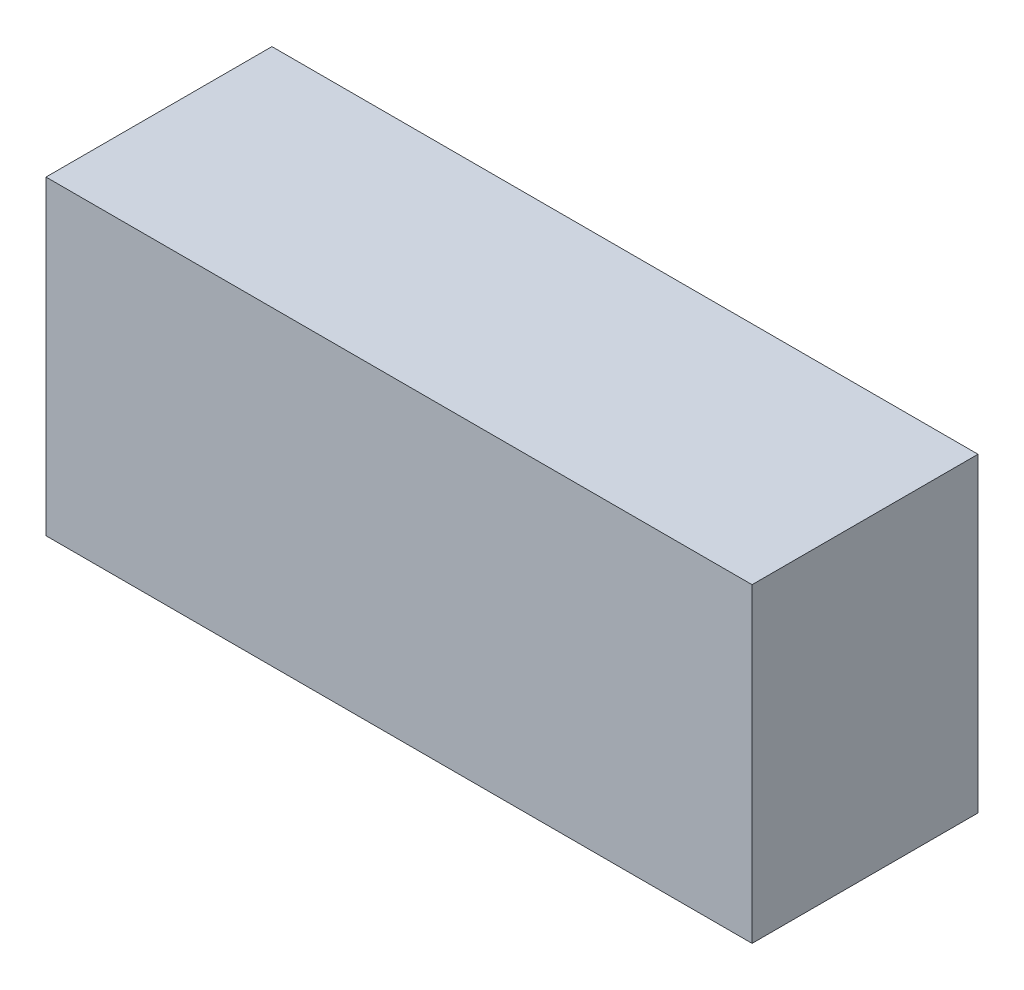
ISO-10303-21;
HEADER;
FILE_DESCRIPTION(('STEP AP214'),'2;1');
FILE_NAME('part.step','',(''),(''),'','','');
FILE_SCHEMA(('AUTOMOTIVE_DESIGN { 1 0 10303 214 1 1 1 1 }'));
ENDSEC;
DATA;
#1=APPLICATION_CONTEXT('core data for automotive mechanical design processes');
#2=APPLICATION_PROTOCOL_DEFINITION('international standard','automotive_design',2000,#1);
#3=PRODUCT_CONTEXT('',#1,'mechanical');
#4=PRODUCT('Part','Part','',(#3));
#5=PRODUCT_RELATED_PRODUCT_CATEGORY('part','',(#4));
#6=PRODUCT_DEFINITION_FORMATION('','',#4);
#7=PRODUCT_DEFINITION_CONTEXT('part definition',#1,'design');
#8=PRODUCT_DEFINITION('design','',#6,#7);
#9=PRODUCT_DEFINITION_SHAPE('','',#8);
#10=(LENGTH_UNIT() NAMED_UNIT(*) SI_UNIT(.MILLI.,.METRE.));
#11=(NAMED_UNIT(*) PLANE_ANGLE_UNIT() SI_UNIT($,.RADIAN.));
#12=(NAMED_UNIT(*) SI_UNIT($,.STERADIAN.) SOLID_ANGLE_UNIT());
#13=UNCERTAINTY_MEASURE_WITH_UNIT(LENGTH_MEASURE(1.E-05),#10,'distance_accuracy_value','');
#14=(GEOMETRIC_REPRESENTATION_CONTEXT(3) GLOBAL_UNCERTAINTY_ASSIGNED_CONTEXT((#13)) GLOBAL_UNIT_ASSIGNED_CONTEXT((#10,
#11,#12)) REPRESENTATION_CONTEXT('',''));
#15=CARTESIAN_POINT('',(0.,0.,0.));
#16=DIRECTION('',(0.,0.,1.));
#17=DIRECTION('',(1.,0.,0.));
#18=AXIS2_PLACEMENT_3D('',#15,#16,#17);
#19=CARTESIAN_POINT('',(-25.,-11.,16.));
#20=DIRECTION('',(1.,0.,0.));
#21=DIRECTION('',(0.,0.,-1.));
#22=AXIS2_PLACEMENT_3D('',#19,#20,#21);
#23=PLANE('',#22);
#24=DIRECTION('',(0.,-1.,0.));
#25=VECTOR('',#24,1.);
#26=CARTESIAN_POINT('',(-25.,-11.,0.));
#27=LINE('',#26,#25);
#28=CARTESIAN_POINT('',(-25.,11.,0.));
#29=VERTEX_POINT('',#28);
#30=CARTESIAN_POINT('',(-25.,-11.,0.));
#31=VERTEX_POINT('',#30);
#32=EDGE_CURVE('E102',#29,#31,#27,.T.);
#33=ORIENTED_EDGE('',*,*,#32,.T.);
#34=DIRECTION('',(0.,0.,-1.));
#35=VECTOR('',#34,1.);
#36=CARTESIAN_POINT('',(-25.,-11.,16.));
#37=LINE('',#36,#35);
#38=CARTESIAN_POINT('',(-25.,-11.,16.));
#39=VERTEX_POINT('',#38);
#40=EDGE_CURVE('E11',#39,#31,#37,.T.);
#41=ORIENTED_EDGE('',*,*,#40,.F.);
#42=DIRECTION('',(0.,-1.,0.));
#43=VECTOR('',#42,1.);
#44=CARTESIAN_POINT('',(-25.,-11.,16.));
#45=LINE('',#44,#43);
#46=CARTESIAN_POINT('',(-25.,11.,16.));
#47=VERTEX_POINT('',#46);
#48=EDGE_CURVE('E90',#47,#39,#45,.T.);
#49=ORIENTED_EDGE('',*,*,#48,.F.);
#50=DIRECTION('',(0.,0.,-1.));
#51=VECTOR('',#50,1.);
#52=CARTESIAN_POINT('',(-25.,11.,16.));
#53=LINE('',#52,#51);
#54=EDGE_CURVE('E98',#47,#29,#53,.T.);
#55=ORIENTED_EDGE('',*,*,#54,.T.);
#56=EDGE_LOOP('',(#33,#41,#49,#55));
#57=FACE_BOUND('',#56,.T.);
#58=ADVANCED_FACE('F39',(#57),#23,.F.);
#59=CARTESIAN_POINT('',(-25.,-11.,16.));
#60=DIRECTION('',(0.,1.,0.));
#61=DIRECTION('',(0.,0.,1.));
#62=AXIS2_PLACEMENT_3D('',#59,#60,#61);
#63=PLANE('',#62);
#64=DIRECTION('',(1.,0.,0.));
#65=VECTOR('',#64,1.);
#66=CARTESIAN_POINT('',(-25.,-11.,0.));
#67=LINE('',#66,#65);
#68=CARTESIAN_POINT('',(25.,-11.,0.));
#69=VERTEX_POINT('',#68);
#70=EDGE_CURVE('E94',#31,#69,#67,.T.);
#71=ORIENTED_EDGE('',*,*,#70,.T.);
#72=DIRECTION('',(0.,0.,-1.));
#73=VECTOR('',#72,1.);
#74=CARTESIAN_POINT('',(25.,-11.,16.));
#75=LINE('',#74,#73);
#76=CARTESIAN_POINT('',(25.,-11.,16.));
#77=VERTEX_POINT('',#76);
#78=EDGE_CURVE('E47',#77,#69,#75,.T.);
#79=ORIENTED_EDGE('',*,*,#78,.F.);
#80=DIRECTION('',(1.,0.,0.));
#81=VECTOR('',#80,1.);
#82=CARTESIAN_POINT('',(-25.,-11.,16.));
#83=LINE('',#82,#81);
#84=EDGE_CURVE('E85',#39,#77,#83,.T.);
#85=ORIENTED_EDGE('',*,*,#84,.F.);
#86=ORIENTED_EDGE('',*,*,#40,.T.);
#87=EDGE_LOOP('',(#71,#79,#85,#86));
#88=FACE_BOUND('',#87,.T.);
#89=ADVANCED_FACE('F93',(#88),#63,.F.);
#90=CARTESIAN_POINT('',(25.,-11.,16.));
#91=DIRECTION('',(-1.,0.,0.));
#92=DIRECTION('',(0.,0.,1.));
#93=AXIS2_PLACEMENT_3D('',#90,#91,#92);
#94=PLANE('',#93);
#95=DIRECTION('',(0.,1.,0.));
#96=VECTOR('',#95,1.);
#97=CARTESIAN_POINT('',(25.,-11.,0.));
#98=LINE('',#97,#96);
#99=CARTESIAN_POINT('',(25.,11.,0.));
#100=VERTEX_POINT('',#99);
#101=EDGE_CURVE('E72',#69,#100,#98,.T.);
#102=ORIENTED_EDGE('',*,*,#101,.T.);
#103=DIRECTION('',(0.,0.,-1.));
#104=VECTOR('',#103,1.);
#105=CARTESIAN_POINT('',(25.,11.,16.));
#106=LINE('',#105,#104);
#107=CARTESIAN_POINT('',(25.,11.,16.));
#108=VERTEX_POINT('',#107);
#109=EDGE_CURVE('E95',#108,#100,#106,.T.);
#110=ORIENTED_EDGE('',*,*,#109,.F.);
#111=DIRECTION('',(0.,1.,0.));
#112=VECTOR('',#111,1.);
#113=CARTESIAN_POINT('',(25.,-11.,16.));
#114=LINE('',#113,#112);
#115=EDGE_CURVE('E88',#77,#108,#114,.T.);
#116=ORIENTED_EDGE('',*,*,#115,.F.);
#117=ORIENTED_EDGE('',*,*,#78,.T.);
#118=EDGE_LOOP('',(#102,#110,#116,#117));
#119=FACE_BOUND('',#118,.T.);
#120=ADVANCED_FACE('F96',(#119),#94,.F.);
#121=CARTESIAN_POINT('',(-25.,11.,16.));
#122=DIRECTION('',(0.,-1.,0.));
#123=DIRECTION('',(0.,0.,-1.));
#124=AXIS2_PLACEMENT_3D('',#121,#122,#123);
#125=PLANE('',#124);
#126=DIRECTION('',(-1.,0.,0.));
#127=VECTOR('',#126,1.);
#128=CARTESIAN_POINT('',(-25.,11.,0.));
#129=LINE('',#128,#127);
#130=EDGE_CURVE('E78',#100,#29,#129,.T.);
#131=ORIENTED_EDGE('',*,*,#130,.T.);
#132=ORIENTED_EDGE('',*,*,#54,.F.);
#133=DIRECTION('',(-1.,0.,0.));
#134=VECTOR('',#133,1.);
#135=CARTESIAN_POINT('',(-25.,11.,16.));
#136=LINE('',#135,#134);
#137=EDGE_CURVE('E55',#108,#47,#136,.T.);
#138=ORIENTED_EDGE('',*,*,#137,.F.);
#139=ORIENTED_EDGE('',*,*,#109,.T.);
#140=EDGE_LOOP('',(#131,#132,#138,#139));
#141=FACE_BOUND('',#140,.T.);
#142=ADVANCED_FACE('F109',(#141),#125,.F.);
#143=CARTESIAN_POINT('',(0.,0.,16.));
#144=DIRECTION('',(0.,0.,-1.));
#145=DIRECTION('',(-1.,0.,0.));
#146=AXIS2_PLACEMENT_3D('',#143,#144,#145);
#147=PLANE('',#146);
#148=ORIENTED_EDGE('',*,*,#48,.T.);
#149=ORIENTED_EDGE('',*,*,#84,.T.);
#150=ORIENTED_EDGE('',*,*,#115,.T.);
#151=ORIENTED_EDGE('',*,*,#137,.T.);
#152=EDGE_LOOP('',(#148,#149,#150,#151));
#153=FACE_BOUND('',#152,.T.);
#154=ADVANCED_FACE('F86',(#153),#147,.F.);
#155=CARTESIAN_POINT('',(0.,0.,0.));
#156=DIRECTION('',(0.,0.,-1.));
#157=DIRECTION('',(-1.,0.,0.));
#158=AXIS2_PLACEMENT_3D('',#155,#156,#157);
#159=PLANE('',#158);
#160=ORIENTED_EDGE('',*,*,#32,.F.);
#161=ORIENTED_EDGE('',*,*,#130,.F.);
#162=ORIENTED_EDGE('',*,*,#101,.F.);
#163=ORIENTED_EDGE('',*,*,#70,.F.);
#164=EDGE_LOOP('',(#160,#161,#162,#163));
#165=FACE_BOUND('',#164,.T.);
#166=ADVANCED_FACE('F112',(#165),#159,.T.);
#167=CLOSED_SHELL('',(#58,#89,#120,#142,#154,#166));
#168=MANIFOLD_SOLID_BREP('B2',#167);
#169=ADVANCED_BREP_SHAPE_REPRESENTATION('',(#18,#168),#14);
#170=SHAPE_DEFINITION_REPRESENTATION(#9,#169);
ENDSEC;
END-ISO-10303-21;
